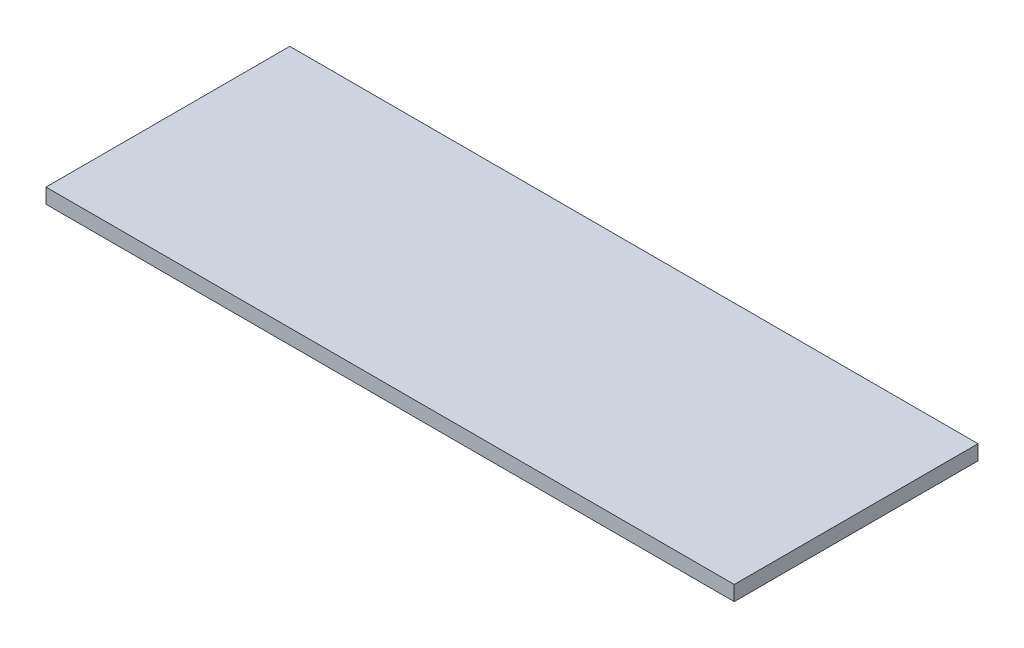
ISO-10303-21;
HEADER;
FILE_DESCRIPTION(('STEP AP214'),'2;1');
FILE_NAME('part.step','',(''),(''),'','','');
FILE_SCHEMA(('AUTOMOTIVE_DESIGN { 1 0 10303 214 1 1 1 1 }'));
ENDSEC;
DATA;
#1=APPLICATION_CONTEXT('core data for automotive mechanical design processes');
#2=APPLICATION_PROTOCOL_DEFINITION('international standard','automotive_design',2000,#1);
#3=PRODUCT_CONTEXT('',#1,'mechanical');
#4=PRODUCT('Part','Part','',(#3));
#5=PRODUCT_RELATED_PRODUCT_CATEGORY('part','',(#4));
#6=PRODUCT_DEFINITION_FORMATION('','',#4);
#7=PRODUCT_DEFINITION_CONTEXT('part definition',#1,'design');
#8=PRODUCT_DEFINITION('design','',#6,#7);
#9=PRODUCT_DEFINITION_SHAPE('','',#8);
#10=(LENGTH_UNIT() NAMED_UNIT(*) SI_UNIT(.MILLI.,.METRE.));
#11=(NAMED_UNIT(*) PLANE_ANGLE_UNIT() SI_UNIT($,.RADIAN.));
#12=(NAMED_UNIT(*) SI_UNIT($,.STERADIAN.) SOLID_ANGLE_UNIT());
#13=UNCERTAINTY_MEASURE_WITH_UNIT(LENGTH_MEASURE(1.E-05),#10,'distance_accuracy_value','');
#14=(GEOMETRIC_REPRESENTATION_CONTEXT(3) GLOBAL_UNCERTAINTY_ASSIGNED_CONTEXT((#13)) GLOBAL_UNIT_ASSIGNED_CONTEXT((#10,
#11,#12)) REPRESENTATION_CONTEXT('',''));
#15=CARTESIAN_POINT('',(0.,0.,0.));
#16=DIRECTION('',(0.,0.,1.));
#17=DIRECTION('',(1.,0.,0.));
#18=AXIS2_PLACEMENT_3D('',#15,#16,#17);
#19=CARTESIAN_POINT('',(-76.2,3.302,26.9875));
#20=DIRECTION('',(1.,0.,0.));
#21=DIRECTION('',(0.,0.,-1.));
#22=AXIS2_PLACEMENT_3D('',#19,#20,#21);
#23=PLANE('',#22);
#24=DIRECTION('',(0.,0.,1.));
#25=VECTOR('',#24,1.);
#26=CARTESIAN_POINT('',(-76.2,0.,26.9875));
#27=LINE('',#26,#25);
#28=CARTESIAN_POINT('',(-76.2,0.,-26.9875));
#29=VERTEX_POINT('',#28);
#30=CARTESIAN_POINT('',(-76.2,0.,26.9875));
#31=VERTEX_POINT('',#30);
#32=EDGE_CURVE('E96',#29,#31,#27,.T.);
#33=ORIENTED_EDGE('',*,*,#32,.T.);
#34=DIRECTION('',(0.,-1.,0.));
#35=VECTOR('',#34,1.);
#36=CARTESIAN_POINT('',(-76.2,3.302,26.9875));
#37=LINE('',#36,#35);
#38=CARTESIAN_POINT('',(-76.2,3.302,26.9875));
#39=VERTEX_POINT('',#38);
#40=EDGE_CURVE('E11',#39,#31,#37,.T.);
#41=ORIENTED_EDGE('',*,*,#40,.F.);
#42=DIRECTION('',(0.,0.,1.));
#43=VECTOR('',#42,1.);
#44=CARTESIAN_POINT('',(-76.2,3.302,26.9875));
#45=LINE('',#44,#43);
#46=CARTESIAN_POINT('',(-76.2,3.302,-26.9875));
#47=VERTEX_POINT('',#46);
#48=EDGE_CURVE('E84',#47,#39,#45,.T.);
#49=ORIENTED_EDGE('',*,*,#48,.F.);
#50=DIRECTION('',(0.,-1.,0.));
#51=VECTOR('',#50,1.);
#52=CARTESIAN_POINT('',(-76.2,3.302,-26.9875));
#53=LINE('',#52,#51);
#54=EDGE_CURVE('E92',#47,#29,#53,.T.);
#55=ORIENTED_EDGE('',*,*,#54,.T.);
#56=EDGE_LOOP('',(#33,#41,#49,#55));
#57=FACE_BOUND('',#56,.T.);
#58=ADVANCED_FACE('F33',(#57),#23,.F.);
#59=CARTESIAN_POINT('',(76.2,3.302,26.9875));
#60=DIRECTION('',(0.,0.,-1.));
#61=DIRECTION('',(-1.,0.,0.));
#62=AXIS2_PLACEMENT_3D('',#59,#60,#61);
#63=PLANE('',#62);
#64=DIRECTION('',(1.,0.,0.));
#65=VECTOR('',#64,1.);
#66=CARTESIAN_POINT('',(76.2,0.,26.9875));
#67=LINE('',#66,#65);
#68=CARTESIAN_POINT('',(76.2,0.,26.9875));
#69=VERTEX_POINT('',#68);
#70=EDGE_CURVE('E88',#31,#69,#67,.T.);
#71=ORIENTED_EDGE('',*,*,#70,.T.);
#72=DIRECTION('',(0.,-1.,0.));
#73=VECTOR('',#72,1.);
#74=CARTESIAN_POINT('',(76.2,3.302,26.9875));
#75=LINE('',#74,#73);
#76=CARTESIAN_POINT('',(76.2,3.302,26.9875));
#77=VERTEX_POINT('',#76);
#78=EDGE_CURVE('E41',#77,#69,#75,.T.);
#79=ORIENTED_EDGE('',*,*,#78,.F.);
#80=DIRECTION('',(1.,0.,0.));
#81=VECTOR('',#80,1.);
#82=CARTESIAN_POINT('',(76.2,3.302,26.9875));
#83=LINE('',#82,#81);
#84=EDGE_CURVE('E79',#39,#77,#83,.T.);
#85=ORIENTED_EDGE('',*,*,#84,.F.);
#86=ORIENTED_EDGE('',*,*,#40,.T.);
#87=EDGE_LOOP('',(#71,#79,#85,#86));
#88=FACE_BOUND('',#87,.T.);
#89=ADVANCED_FACE('F87',(#88),#63,.F.);
#90=CARTESIAN_POINT('',(76.2,3.302,26.9875));
#91=DIRECTION('',(-1.,0.,0.));
#92=DIRECTION('',(0.,0.,1.));
#93=AXIS2_PLACEMENT_3D('',#90,#91,#92);
#94=PLANE('',#93);
#95=DIRECTION('',(0.,0.,-1.));
#96=VECTOR('',#95,1.);
#97=CARTESIAN_POINT('',(76.2,0.,26.9875));
#98=LINE('',#97,#96);
#99=CARTESIAN_POINT('',(76.2,0.,-26.9875));
#100=VERTEX_POINT('',#99);
#101=EDGE_CURVE('E66',#69,#100,#98,.T.);
#102=ORIENTED_EDGE('',*,*,#101,.T.);
#103=DIRECTION('',(0.,-1.,0.));
#104=VECTOR('',#103,1.);
#105=CARTESIAN_POINT('',(76.2,3.302,-26.9875));
#106=LINE('',#105,#104);
#107=CARTESIAN_POINT('',(76.2,3.302,-26.9875));
#108=VERTEX_POINT('',#107);
#109=EDGE_CURVE('E89',#108,#100,#106,.T.);
#110=ORIENTED_EDGE('',*,*,#109,.F.);
#111=DIRECTION('',(0.,0.,-1.));
#112=VECTOR('',#111,1.);
#113=CARTESIAN_POINT('',(76.2,3.302,26.9875));
#114=LINE('',#113,#112);
#115=EDGE_CURVE('E82',#77,#108,#114,.T.);
#116=ORIENTED_EDGE('',*,*,#115,.F.);
#117=ORIENTED_EDGE('',*,*,#78,.T.);
#118=EDGE_LOOP('',(#102,#110,#116,#117));
#119=FACE_BOUND('',#118,.T.);
#120=ADVANCED_FACE('F90',(#119),#94,.F.);
#121=CARTESIAN_POINT('',(76.2,3.302,-26.9875));
#122=DIRECTION('',(0.,0.,1.));
#123=DIRECTION('',(1.,0.,0.));
#124=AXIS2_PLACEMENT_3D('',#121,#122,#123);
#125=PLANE('',#124);
#126=DIRECTION('',(-1.,0.,0.));
#127=VECTOR('',#126,1.);
#128=CARTESIAN_POINT('',(76.2,0.,-26.9875));
#129=LINE('',#128,#127);
#130=EDGE_CURVE('E72',#100,#29,#129,.T.);
#131=ORIENTED_EDGE('',*,*,#130,.T.);
#132=ORIENTED_EDGE('',*,*,#54,.F.);
#133=DIRECTION('',(-1.,0.,0.));
#134=VECTOR('',#133,1.);
#135=CARTESIAN_POINT('',(76.2,3.302,-26.9875));
#136=LINE('',#135,#134);
#137=EDGE_CURVE('E49',#108,#47,#136,.T.);
#138=ORIENTED_EDGE('',*,*,#137,.F.);
#139=ORIENTED_EDGE('',*,*,#109,.T.);
#140=EDGE_LOOP('',(#131,#132,#138,#139));
#141=FACE_BOUND('',#140,.T.);
#142=ADVANCED_FACE('F103',(#141),#125,.F.);
#143=CARTESIAN_POINT('',(0.,3.302,0.));
#144=DIRECTION('',(0.,1.,0.));
#145=DIRECTION('',(0.,0.,1.));
#146=AXIS2_PLACEMENT_3D('',#143,#144,#145);
#147=PLANE('',#146);
#148=ORIENTED_EDGE('',*,*,#48,.T.);
#149=ORIENTED_EDGE('',*,*,#84,.T.);
#150=ORIENTED_EDGE('',*,*,#115,.T.);
#151=ORIENTED_EDGE('',*,*,#137,.T.);
#152=EDGE_LOOP('',(#148,#149,#150,#151));
#153=FACE_BOUND('',#152,.T.);
#154=ADVANCED_FACE('F80',(#153),#147,.T.);
#155=CARTESIAN_POINT('',(0.,0.,0.));
#156=DIRECTION('',(0.,1.,0.));
#157=DIRECTION('',(0.,0.,1.));
#158=AXIS2_PLACEMENT_3D('',#155,#156,#157);
#159=PLANE('',#158);
#160=ORIENTED_EDGE('',*,*,#32,.F.);
#161=ORIENTED_EDGE('',*,*,#130,.F.);
#162=ORIENTED_EDGE('',*,*,#101,.F.);
#163=ORIENTED_EDGE('',*,*,#70,.F.);
#164=EDGE_LOOP('',(#160,#161,#162,#163));
#165=FACE_BOUND('',#164,.T.);
#166=ADVANCED_FACE('F106',(#165),#159,.F.);
#167=CLOSED_SHELL('',(#58,#89,#120,#142,#154,#166));
#168=MANIFOLD_SOLID_BREP('B2',#167);
#169=ADVANCED_BREP_SHAPE_REPRESENTATION('',(#18,#168),#14);
#170=SHAPE_DEFINITION_REPRESENTATION(#9,#169);
ENDSEC;
END-ISO-10303-21;
